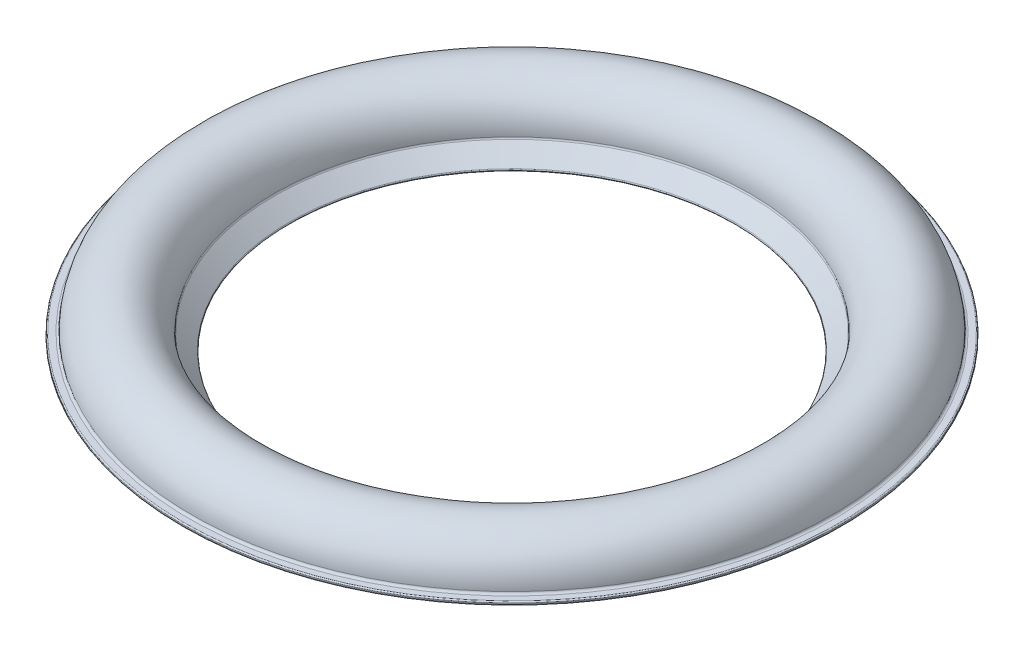
ISO-10303-21;
HEADER;
FILE_DESCRIPTION(('STEP AP214'),'2;1');
FILE_NAME('part.step','',(''),(''),'','','');
FILE_SCHEMA(('AUTOMOTIVE_DESIGN { 1 0 10303 214 1 1 1 1 }'));
ENDSEC;
DATA;
#1=APPLICATION_CONTEXT('core data for automotive mechanical design processes');
#2=APPLICATION_PROTOCOL_DEFINITION('international standard','automotive_design',2000,#1);
#3=PRODUCT_CONTEXT('',#1,'mechanical');
#4=PRODUCT('Part','Part','',(#3));
#5=PRODUCT_RELATED_PRODUCT_CATEGORY('part','',(#4));
#6=PRODUCT_DEFINITION_FORMATION('','',#4);
#7=PRODUCT_DEFINITION_CONTEXT('part definition',#1,'design');
#8=PRODUCT_DEFINITION('design','',#6,#7);
#9=PRODUCT_DEFINITION_SHAPE('','',#8);
#10=(LENGTH_UNIT() NAMED_UNIT(*) SI_UNIT(.MILLI.,.METRE.));
#11=(NAMED_UNIT(*) PLANE_ANGLE_UNIT() SI_UNIT($,.RADIAN.));
#12=(NAMED_UNIT(*) SI_UNIT($,.STERADIAN.) SOLID_ANGLE_UNIT());
#13=UNCERTAINTY_MEASURE_WITH_UNIT(LENGTH_MEASURE(1.E-05),#10,'distance_accuracy_value','');
#14=(GEOMETRIC_REPRESENTATION_CONTEXT(3) GLOBAL_UNCERTAINTY_ASSIGNED_CONTEXT((#13)) GLOBAL_UNIT_ASSIGNED_CONTEXT((#10,
#11,#12)) REPRESENTATION_CONTEXT('',''));
#15=CARTESIAN_POINT('',(0.,0.,0.));
#16=DIRECTION('',(0.,0.,1.));
#17=DIRECTION('',(1.,0.,0.));
#18=AXIS2_PLACEMENT_3D('',#15,#16,#17);
#19=CARTESIAN_POINT('',(0.,97.8774464791081,0.));
#20=DIRECTION('',(0.,-1.,0.));
#21=DIRECTION('',(0.,0.,-1.));
#22=AXIS2_PLACEMENT_3D('',#19,#20,#21);
#23=TOROIDAL_SURFACE('',#22,138.232480040969,1.);
#24=CARTESIAN_POINT('',(0.,97.823392425054,0.));
#25=DIRECTION('',(0.,-1.,0.));
#26=DIRECTION('',(0.,0.,-1.));
#27=AXIS2_PLACEMENT_3D('',#24,#25,#26);
#28=CIRCLE('',#27,137.233942030055);
#29=CARTESIAN_POINT('',(0.,97.823392425054,-137.233942030056));
#30=VERTEX_POINT('',#29);
#31=EDGE_CURVE('E91',#30,#30,#28,.T.);
#32=ORIENTED_EDGE('',*,*,#31,.T.);
#33=EDGE_LOOP('',(#32));
#34=FACE_BOUND('',#33,.T.);
#35=CARTESIAN_POINT('',(0.,96.8774464791081,0.));
#36=DIRECTION('',(0.,-1.,0.));
#37=DIRECTION('',(0.,0.,-1.));
#38=AXIS2_PLACEMENT_3D('',#35,#36,#37);
#39=CIRCLE('',#38,138.232480040969);
#40=CARTESIAN_POINT('',(0.,96.8774464791081,-138.23248004097));
#41=VERTEX_POINT('',#40);
#42=EDGE_CURVE('E11',#41,#41,#39,.T.);
#43=ORIENTED_EDGE('',*,*,#42,.F.);
#44=EDGE_LOOP('',(#43));
#45=FACE_BOUND('',#44,.T.);
#46=ADVANCED_FACE('F36',(#34,#45),#23,.F.);
#47=CARTESIAN_POINT('',(138.23248004097,96.8774464791081,0.));
#48=DIRECTION('',(0.,-1.,0.));
#49=DIRECTION('',(0.,0.,-1.));
#50=AXIS2_PLACEMENT_3D('',#47,#48,#49);
#51=PLANE('',#50);
#52=CARTESIAN_POINT('',(0.,96.8774464791081,0.));
#53=DIRECTION('',(0.,-1.,0.));
#54=DIRECTION('',(0.,0.,-1.));
#55=AXIS2_PLACEMENT_3D('',#52,#53,#54);
#56=CIRCLE('',#55,140.759526839058);
#57=CARTESIAN_POINT('',(0.,96.8774464791081,-140.759526839059));
#58=VERTEX_POINT('',#57);
#59=EDGE_CURVE('E42',#58,#58,#56,.T.);
#60=ORIENTED_EDGE('',*,*,#59,.F.);
#61=EDGE_LOOP('',(#60));
#62=FACE_BOUND('',#61,.T.);
#63=ORIENTED_EDGE('',*,*,#42,.T.);
#64=EDGE_LOOP('',(#63));
#65=FACE_BOUND('',#64,.T.);
#66=ADVANCED_FACE('F109',(#62,#65),#51,.F.);
#67=CARTESIAN_POINT('',(0.,96.3774464791081,0.));
#68=DIRECTION('',(0.,-1.,0.));
#69=DIRECTION('',(0.,0.,-1.));
#70=AXIS2_PLACEMENT_3D('',#67,#68,#69);
#71=TOROIDAL_SURFACE('',#70,140.759526839058,0.5);
#72=CARTESIAN_POINT('',(0.,96.3774464791081,0.));
#73=DIRECTION('',(0.,-1.,0.));
#74=DIRECTION('',(0.,0.,-1.));
#75=AXIS2_PLACEMENT_3D('',#72,#73,#74);
#76=CIRCLE('',#75,141.259526839058);
#77=CARTESIAN_POINT('',(0.,96.3774464791081,-141.259526839059));
#78=VERTEX_POINT('',#77);
#79=EDGE_CURVE('E46',#78,#78,#76,.T.);
#80=ORIENTED_EDGE('',*,*,#79,.F.);
#81=EDGE_LOOP('',(#80));
#82=FACE_BOUND('',#81,.T.);
#83=ORIENTED_EDGE('',*,*,#59,.T.);
#84=EDGE_LOOP('',(#83));
#85=FACE_BOUND('',#84,.T.);
#86=ADVANCED_FACE('F113',(#82,#85),#71,.T.);
#87=CARTESIAN_POINT('',(0.,0.,0.));
#88=DIRECTION('',(0.,-1.,0.));
#89=DIRECTION('',(0.,0.,-1.));
#90=AXIS2_PLACEMENT_3D('',#87,#88,#89);
#91=CYLINDRICAL_SURFACE('',#90,141.259526839058);
#92=CARTESIAN_POINT('',(0.,95.8774464791081,0.));
#93=DIRECTION('',(0.,-1.,0.));
#94=DIRECTION('',(0.,0.,-1.));
#95=AXIS2_PLACEMENT_3D('',#92,#93,#94);
#96=CIRCLE('',#95,141.259526839058);
#97=CARTESIAN_POINT('',(0.,95.8774464791081,-141.259526839059));
#98=VERTEX_POINT('',#97);
#99=EDGE_CURVE('E50',#98,#98,#96,.T.);
#100=ORIENTED_EDGE('',*,*,#99,.F.);
#101=EDGE_LOOP('',(#100));
#102=FACE_BOUND('',#101,.T.);
#103=ORIENTED_EDGE('',*,*,#79,.T.);
#104=EDGE_LOOP('',(#103));
#105=FACE_BOUND('',#104,.T.);
#106=ADVANCED_FACE('F118',(#102,#105),#91,.T.);
#107=CARTESIAN_POINT('',(0.,95.8774464791081,0.));
#108=DIRECTION('',(0.,-1.,0.));
#109=DIRECTION('',(0.,0.,-1.));
#110=AXIS2_PLACEMENT_3D('',#107,#108,#109);
#111=TOROIDAL_SURFACE('',#110,140.759526839058,0.5);
#112=CARTESIAN_POINT('',(0.,95.3774464791081,0.));
#113=DIRECTION('',(0.,-1.,0.));
#114=DIRECTION('',(0.,0.,-1.));
#115=AXIS2_PLACEMENT_3D('',#112,#113,#114);
#116=CIRCLE('',#115,140.759526839058);
#117=CARTESIAN_POINT('',(0.,95.3774464791081,-140.759526839059));
#118=VERTEX_POINT('',#117);
#119=EDGE_CURVE('E55',#118,#118,#116,.T.);
#120=ORIENTED_EDGE('',*,*,#119,.F.);
#121=EDGE_LOOP('',(#120));
#122=FACE_BOUND('',#121,.T.);
#123=ORIENTED_EDGE('',*,*,#99,.T.);
#124=EDGE_LOOP('',(#123));
#125=FACE_BOUND('',#124,.T.);
#126=ADVANCED_FACE('F124',(#122,#125),#111,.T.);
#127=CARTESIAN_POINT('',(140.759526839059,95.3774464791081,0.));
#128=DIRECTION('',(0.,1.,0.));
#129=DIRECTION('',(0.,0.,1.));
#130=AXIS2_PLACEMENT_3D('',#127,#128,#129);
#131=PLANE('',#130);
#132=CARTESIAN_POINT('',(0.,95.3774464791081,0.));
#133=DIRECTION('',(0.,-1.,0.));
#134=DIRECTION('',(0.,0.,-1.));
#135=AXIS2_PLACEMENT_3D('',#132,#133,#134);
#136=CIRCLE('',#135,136.752172307024);
#137=CARTESIAN_POINT('',(0.,95.3774464791081,-136.752172307024));
#138=VERTEX_POINT('',#137);
#139=EDGE_CURVE('E58',#138,#138,#136,.T.);
#140=ORIENTED_EDGE('',*,*,#139,.F.);
#141=EDGE_LOOP('',(#140));
#142=FACE_BOUND('',#141,.T.);
#143=ORIENTED_EDGE('',*,*,#119,.T.);
#144=EDGE_LOOP('',(#143));
#145=FACE_BOUND('',#144,.T.);
#146=ADVANCED_FACE('F128',(#142,#145),#131,.F.);
#147=CARTESIAN_POINT('',(0.,96.3774464791081,0.));
#148=DIRECTION('',(0.,-1.,0.));
#149=DIRECTION('',(0.,0.,-1.));
#150=AXIS2_PLACEMENT_3D('',#147,#148,#149);
#151=TOROIDAL_SURFACE('',#150,136.752172307024,1.00000000000002);
#152=CARTESIAN_POINT('',(0.,96.4068582438139,0.));
#153=DIRECTION('',(0.,-1.,0.));
#154=DIRECTION('',(0.,0.,-1.));
#155=AXIS2_PLACEMENT_3D('',#152,#153,#154);
#156=CIRCLE('',#155,135.752604926555);
#157=CARTESIAN_POINT('',(0.,96.4068582438139,-135.752604926556));
#158=VERTEX_POINT('',#157);
#159=EDGE_CURVE('E61',#158,#158,#156,.T.);
#160=ORIENTED_EDGE('',*,*,#159,.F.);
#161=EDGE_LOOP('',(#160));
#162=FACE_BOUND('',#161,.T.);
#163=ORIENTED_EDGE('',*,*,#139,.T.);
#164=EDGE_LOOP('',(#163));
#165=FACE_BOUND('',#164,.T.);
#166=ADVANCED_FACE('F132',(#162,#165),#151,.T.);
#167=CARTESIAN_POINT('',(0.,96.8774464791078,0.));
#168=DIRECTION('',(0.,-1.,0.));
#169=DIRECTION('',(0.,0.,-1.));
#170=AXIS2_PLACEMENT_3D('',#167,#168,#169);
#171=TOROIDAL_SURFACE('',#170,119.759526839058,15.9999999999989);
#172=CARTESIAN_POINT('',(0.,96.7057488276495,0.));
#173=DIRECTION('',(0.,-1.,0.));
#174=DIRECTION('',(0.,0.,-1.));
#175=AXIS2_PLACEMENT_3D('',#172,#173,#174);
#176=CIRCLE('',#175,103.760448118193);
#177=CARTESIAN_POINT('',(0.,96.7057488276495,-103.760448118193));
#178=VERTEX_POINT('',#177);
#179=EDGE_CURVE('E64',#178,#178,#176,.T.);
#180=ORIENTED_EDGE('',*,*,#179,.F.);
#181=EDGE_LOOP('',(#180));
#182=FACE_BOUND('',#181,.T.);
#183=ORIENTED_EDGE('',*,*,#159,.T.);
#184=EDGE_LOOP('',(#183));
#185=FACE_BOUND('',#184,.T.);
#186=ADVANCED_FACE('F136',(#182,#185),#171,.F.);
#187=CARTESIAN_POINT('',(0.,96.6950177244334,0.));
#188=DIRECTION('',(0.,-1.,0.));
#189=DIRECTION('',(0.,0.,-1.));
#190=AXIS2_PLACEMENT_3D('',#187,#188,#189);
#191=TOROIDAL_SURFACE('',#190,102.760505698139,1.00000000000001);
#192=CARTESIAN_POINT('',(0.,95.9879109432468,0.));
#193=DIRECTION('',(0.,-1.,0.));
#194=DIRECTION('',(0.,0.,-1.));
#195=AXIS2_PLACEMENT_3D('',#192,#193,#194);
#196=CIRCLE('',#195,103.467612479325);
#197=CARTESIAN_POINT('',(0.,95.9879109432468,-103.467612479326));
#198=VERTEX_POINT('',#197);
#199=EDGE_CURVE('E67',#198,#198,#196,.T.);
#200=ORIENTED_EDGE('',*,*,#199,.F.);
#201=EDGE_LOOP('',(#200));
#202=FACE_BOUND('',#201,.T.);
#203=ORIENTED_EDGE('',*,*,#179,.T.);
#204=EDGE_LOOP('',(#203));
#205=FACE_BOUND('',#204,.T.);
#206=ADVANCED_FACE('F140',(#202,#205),#191,.T.);
#207=CARTESIAN_POINT('',(0.,95.3758706645026,0.));
#208=DIRECTION('',(0.,1.,0.));
#209=DIRECTION('',(0.,0.,1.));
#210=AXIS2_PLACEMENT_3D('',#207,#208,#209);
#211=CONICAL_SURFACE('',#210,102.855572200581,0.785398163397482);
#212=ORIENTED_EDGE('',*,*,#199,.T.);
#213=EDGE_LOOP('',(#212));
#214=FACE_BOUND('',#213,.T.);
#215=CARTESIAN_POINT('',(0.,95.3758706645026,0.));
#216=DIRECTION('',(0.,-1.,0.));
#217=DIRECTION('',(0.,0.,-1.));
#218=AXIS2_PLACEMENT_3D('',#215,#216,#217);
#219=CIRCLE('',#218,102.855572200581);
#220=CARTESIAN_POINT('',(0.,95.3758706645026,-102.855572200581));
#221=VERTEX_POINT('',#220);
#222=EDGE_CURVE('E70',#221,#221,#219,.T.);
#223=ORIENTED_EDGE('',*,*,#222,.F.);
#224=EDGE_LOOP('',(#223));
#225=FACE_BOUND('',#224,.T.);
#226=ADVANCED_FACE('F144',(#214,#225),#211,.T.);
#227=CARTESIAN_POINT('',(0.,89.2549432980966,0.));
#228=DIRECTION('',(0.,1.,0.));
#229=DIRECTION('',(0.,0.,1.));
#230=AXIS2_PLACEMENT_3D('',#227,#228,#229);
#231=CONICAL_SURFACE('',#230,96.3945933138191,0.812418612584716);
#232=ORIENTED_EDGE('',*,*,#222,.T.);
#233=EDGE_LOOP('',(#232));
#234=FACE_BOUND('',#233,.T.);
#235=CARTESIAN_POINT('',(0.,89.2549432980966,0.));
#236=DIRECTION('',(0.,-1.,0.));
#237=DIRECTION('',(0.,0.,-1.));
#238=AXIS2_PLACEMENT_3D('',#235,#236,#237);
#239=CIRCLE('',#238,96.3945933138191);
#240=CARTESIAN_POINT('',(0.,89.2549432980966,-96.3945933138195));
#241=VERTEX_POINT('',#240);
#242=EDGE_CURVE('E73',#241,#241,#239,.T.);
#243=ORIENTED_EDGE('',*,*,#242,.F.);
#244=EDGE_LOOP('',(#243));
#245=FACE_BOUND('',#244,.T.);
#246=ADVANCED_FACE('F148',(#234,#245),#231,.T.);
#247=CARTESIAN_POINT('',(0.,89.6179196400496,0.));
#248=DIRECTION('',(0.,-1.,0.));
#249=DIRECTION('',(0.,0.,-1.));
#250=AXIS2_PLACEMENT_3D('',#247,#248,#249);
#251=TOROIDAL_SURFACE('',#250,96.0507209898637,0.500000000000009);
#252=ORIENTED_EDGE('',*,*,#242,.T.);
#253=EDGE_LOOP('',(#252));
#254=FACE_BOUND('',#253,.T.);
#255=CARTESIAN_POINT('',(0.,89.2740473160941,0.));
#256=DIRECTION('',(0.,-1.,0.));
#257=DIRECTION('',(0.,0.,-1.));
#258=AXIS2_PLACEMENT_3D('',#255,#256,#257);
#259=CIRCLE('',#258,95.6877446479108);
#260=CARTESIAN_POINT('',(0.,89.2740473160941,-95.6877446479112));
#261=VERTEX_POINT('',#260);
#262=EDGE_CURVE('E76',#261,#261,#259,.T.);
#263=ORIENTED_EDGE('',*,*,#262,.F.);
#264=EDGE_LOOP('',(#263));
#265=FACE_BOUND('',#264,.T.);
#266=ADVANCED_FACE('F152',(#254,#265),#251,.T.);
#267=CARTESIAN_POINT('',(0.,89.6370236580471,0.));
#268=DIRECTION('',(0.,-1.,0.));
#269=DIRECTION('',(0.,0.,-1.));
#270=AXIS2_PLACEMENT_3D('',#267,#268,#269);
#271=CONICAL_SURFACE('',#270,95.3438723239554,0.758377714210198);
#272=ORIENTED_EDGE('',*,*,#262,.T.);
#273=EDGE_LOOP('',(#272));
#274=FACE_BOUND('',#273,.T.);
#275=CARTESIAN_POINT('',(0.,89.6370236580471,0.));
#276=DIRECTION('',(0.,-1.,0.));
#277=DIRECTION('',(0.,0.,-1.));
#278=AXIS2_PLACEMENT_3D('',#275,#276,#277);
#279=CIRCLE('',#278,95.3438723239554);
#280=CARTESIAN_POINT('',(0.,89.6370236580471,-95.3438723239557));
#281=VERTEX_POINT('',#280);
#282=EDGE_CURVE('E79',#281,#281,#279,.T.);
#283=ORIENTED_EDGE('',*,*,#282,.F.);
#284=EDGE_LOOP('',(#283));
#285=FACE_BOUND('',#284,.T.);
#286=ADVANCED_FACE('F156',(#274,#285),#271,.F.);
#287=CARTESIAN_POINT('',(0.,89.9808959820025,0.));
#288=DIRECTION('',(0.,-1.,0.));
#289=DIRECTION('',(0.,0.,-1.));
#290=AXIS2_PLACEMENT_3D('',#287,#288,#289);
#291=TOROIDAL_SURFACE('',#290,95.7068486659083,0.500000000000014);
#292=ORIENTED_EDGE('',*,*,#282,.T.);
#293=EDGE_LOOP('',(#292));
#294=FACE_BOUND('',#293,.T.);
#295=CARTESIAN_POINT('',(0.,90.3438723239554,0.));
#296=DIRECTION('',(0.,-1.,0.));
#297=DIRECTION('',(0.,0.,-1.));
#298=AXIS2_PLACEMENT_3D('',#295,#296,#297);
#299=CIRCLE('',#298,95.3629763419529);
#300=CARTESIAN_POINT('',(0.,90.3438723239554,-95.3629763419532));
#301=VERTEX_POINT('',#300);
#302=EDGE_CURVE('E82',#301,#301,#299,.T.);
#303=ORIENTED_EDGE('',*,*,#302,.F.);
#304=EDGE_LOOP('',(#303));
#305=FACE_BOUND('',#304,.T.);
#306=ADVANCED_FACE('F160',(#294,#305),#291,.T.);
#307=CARTESIAN_POINT('',(0.,90.3438723239554,0.));
#308=DIRECTION('',(0.,1.,0.));
#309=DIRECTION('',(0.,0.,1.));
#310=AXIS2_PLACEMENT_3D('',#307,#308,#309);
#311=CONICAL_SURFACE('',#310,95.3629763419529,0.812418612584717);
#312=CARTESIAN_POINT('',(0.,96.5864707980292,0.));
#313=DIRECTION('',(0.,-1.,0.));
#314=DIRECTION('',(0.,0.,-1.));
#315=AXIS2_PLACEMENT_3D('',#312,#313,#314);
#316=CIRCLE('',#315,101.952385842364);
#317=CARTESIAN_POINT('',(0.,96.5864707980292,-101.952385842365));
#318=VERTEX_POINT('',#317);
#319=EDGE_CURVE('E85',#318,#318,#316,.T.);
#320=ORIENTED_EDGE('',*,*,#319,.F.);
#321=EDGE_LOOP('',(#320));
#322=FACE_BOUND('',#321,.T.);
#323=ORIENTED_EDGE('',*,*,#302,.T.);
#324=EDGE_LOOP('',(#323));
#325=FACE_BOUND('',#324,.T.);
#326=ADVANCED_FACE('F105',(#322,#325),#311,.F.);
#327=CARTESIAN_POINT('',(0.,97.312423481935,0.));
#328=DIRECTION('',(0.,-1.,0.));
#329=DIRECTION('',(0.,0.,-1.));
#330=AXIS2_PLACEMENT_3D('',#327,#328,#329);
#331=TOROIDAL_SURFACE('',#330,101.264641194453,1.);
#332=ORIENTED_EDGE('',*,*,#319,.T.);
#333=EDGE_LOOP('',(#332));
#334=FACE_BOUND('',#333,.T.);
#335=CARTESIAN_POINT('',(0.,97.2889112115119,0.));
#336=DIRECTION('',(0.,-1.,0.));
#337=DIRECTION('',(0.,0.,-1.));
#338=AXIS2_PLACEMENT_3D('',#335,#336,#337);
#339=CIRCLE('',#338,102.26436474281);
#340=CARTESIAN_POINT('',(0.,97.2889112115119,-102.264364742811));
#341=VERTEX_POINT('',#340);
#342=EDGE_CURVE('E88',#341,#341,#339,.T.);
#343=ORIENTED_EDGE('',*,*,#342,.F.);
#344=EDGE_LOOP('',(#343));
#345=FACE_BOUND('',#344,.T.);
#346=ADVANCED_FACE('F99',(#334,#345),#331,.F.);
#347=CARTESIAN_POINT('',(0.,96.8774464791078,0.));
#348=DIRECTION('',(0.,-1.,0.));
#349=DIRECTION('',(0.,0.,-1.));
#350=AXIS2_PLACEMENT_3D('',#347,#348,#349);
#351=TOROIDAL_SURFACE('',#350,119.759526839058,17.5);
#352=ORIENTED_EDGE('',*,*,#342,.T.);
#353=EDGE_LOOP('',(#352));
#354=FACE_BOUND('',#353,.T.);
#355=ORIENTED_EDGE('',*,*,#31,.F.);
#356=EDGE_LOOP('',(#355));
#357=FACE_BOUND('',#356,.T.);
#358=ADVANCED_FACE('F97',(#354,#357),#351,.T.);
#359=CLOSED_SHELL('',(#46,#66,#86,#106,#126,#146,#166,#186,#206,#226,#246,#266,#286,#306,#326,
#346,#358));
#360=MANIFOLD_SOLID_BREP('B2',#359);
#361=ADVANCED_BREP_SHAPE_REPRESENTATION('',(#18,#360),#14);
#362=SHAPE_DEFINITION_REPRESENTATION(#9,#361);
ENDSEC;
END-ISO-10303-21;
